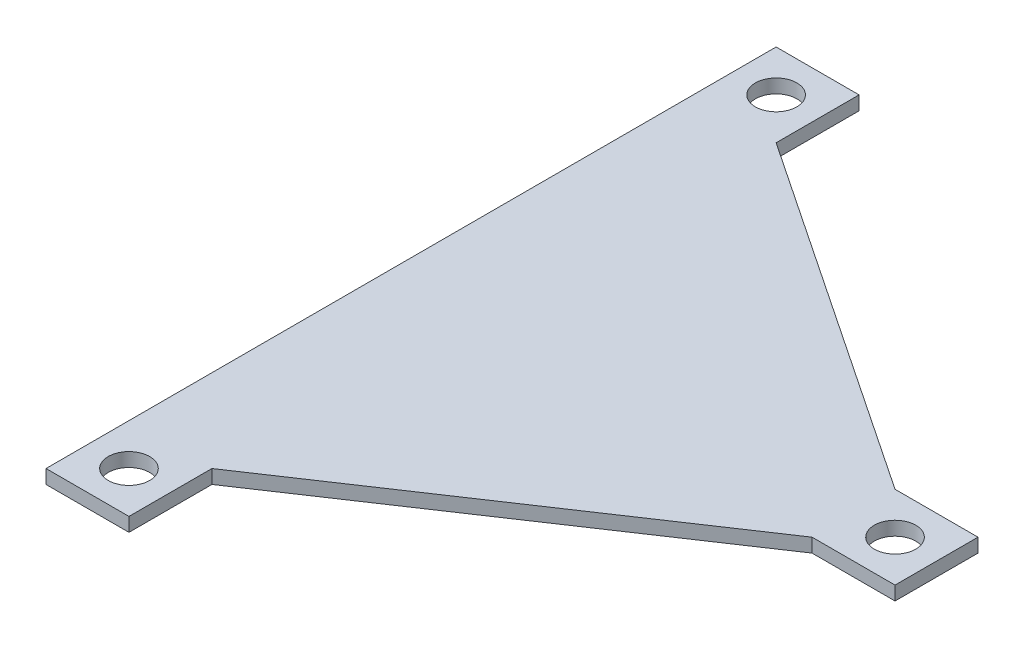
ISO-10303-21;
HEADER;
FILE_DESCRIPTION(('STEP AP214'),'2;1');
FILE_NAME('part.step','',(''),(''),'','','');
FILE_SCHEMA(('AUTOMOTIVE_DESIGN { 1 0 10303 214 1 1 1 1 }'));
ENDSEC;
DATA;
#1=APPLICATION_CONTEXT('core data for automotive mechanical design processes');
#2=APPLICATION_PROTOCOL_DEFINITION('international standard','automotive_design',2000,#1);
#3=PRODUCT_CONTEXT('',#1,'mechanical');
#4=PRODUCT('Part','Part','',(#3));
#5=PRODUCT_RELATED_PRODUCT_CATEGORY('part','',(#4));
#6=PRODUCT_DEFINITION_FORMATION('','',#4);
#7=PRODUCT_DEFINITION_CONTEXT('part definition',#1,'design');
#8=PRODUCT_DEFINITION('design','',#6,#7);
#9=PRODUCT_DEFINITION_SHAPE('','',#8);
#10=(LENGTH_UNIT() NAMED_UNIT(*) SI_UNIT(.MILLI.,.METRE.));
#11=(NAMED_UNIT(*) PLANE_ANGLE_UNIT() SI_UNIT($,.RADIAN.));
#12=(NAMED_UNIT(*) SI_UNIT($,.STERADIAN.) SOLID_ANGLE_UNIT());
#13=UNCERTAINTY_MEASURE_WITH_UNIT(LENGTH_MEASURE(1.E-05),#10,'distance_accuracy_value','');
#14=(GEOMETRIC_REPRESENTATION_CONTEXT(3) GLOBAL_UNCERTAINTY_ASSIGNED_CONTEXT((#13)) GLOBAL_UNIT_ASSIGNED_CONTEXT((#10,
#11,#12)) REPRESENTATION_CONTEXT('',''));
#15=CARTESIAN_POINT('',(0.,0.,0.));
#16=DIRECTION('',(0.,0.,1.));
#17=DIRECTION('',(1.,0.,0.));
#18=AXIS2_PLACEMENT_3D('',#15,#16,#17);
#19=CARTESIAN_POINT('',(0.,1.,0.));
#20=DIRECTION('',(0.,-1.,0.));
#21=DIRECTION('',(0.,0.,-1.));
#22=AXIS2_PLACEMENT_3D('',#19,#20,#21);
#23=PLANE('',#22);
#24=DIRECTION('',(0.,0.,-1.));
#25=VECTOR('',#24,1.);
#26=CARTESIAN_POINT('',(3.,1.,49.8));
#27=LINE('',#26,#25);
#28=CARTESIAN_POINT('',(3.,1.,49.8));
#29=VERTEX_POINT('',#28);
#30=CARTESIAN_POINT('',(3.,1.,43.8));
#31=VERTEX_POINT('',#30);
#32=EDGE_CURVE('E170',#29,#31,#27,.T.);
#33=ORIENTED_EDGE('',*,*,#32,.T.);
#34=DIRECTION('',(0.831065477040289,0.,-0.556174588480809));
#35=VECTOR('',#34,1.);
#36=CARTESIAN_POINT('',(3.,1.,43.8));
#37=LINE('',#36,#35);
#38=CARTESIAN_POINT('',(29.,1.,26.4));
#39=VERTEX_POINT('',#38);
#40=EDGE_CURVE('E104',#31,#39,#37,.T.);
#41=ORIENTED_EDGE('',*,*,#40,.T.);
#42=DIRECTION('',(1.,0.,0.));
#43=VECTOR('',#42,1.);
#44=CARTESIAN_POINT('',(29.,1.,26.4));
#45=LINE('',#44,#43);
#46=CARTESIAN_POINT('',(35.,1.,26.4));
#47=VERTEX_POINT('',#46);
#48=EDGE_CURVE('E187',#39,#47,#45,.T.);
#49=ORIENTED_EDGE('',*,*,#48,.T.);
#50=DIRECTION('',(0.,0.,-1.));
#51=VECTOR('',#50,1.);
#52=CARTESIAN_POINT('',(35.,1.,26.4));
#53=LINE('',#52,#51);
#54=CARTESIAN_POINT('',(35.,1.,20.4));
#55=VERTEX_POINT('',#54);
#56=EDGE_CURVE('E210',#47,#55,#53,.T.);
#57=ORIENTED_EDGE('',*,*,#56,.T.);
#58=DIRECTION('',(-1.,0.,0.));
#59=VECTOR('',#58,1.);
#60=CARTESIAN_POINT('',(35.,1.,20.4));
#61=LINE('',#60,#59);
#62=CARTESIAN_POINT('',(29.,1.,20.4));
#63=VERTEX_POINT('',#62);
#64=EDGE_CURVE('E204',#55,#63,#61,.T.);
#65=ORIENTED_EDGE('',*,*,#64,.T.);
#66=DIRECTION('',(-0.831065477040289,0.,-0.556174588480808));
#67=VECTOR('',#66,1.);
#68=CARTESIAN_POINT('',(29.,1.,20.4));
#69=LINE('',#68,#67);
#70=CARTESIAN_POINT('',(2.99999999999999,1.,3.));
#71=VERTEX_POINT('',#70);
#72=EDGE_CURVE('E206',#63,#71,#69,.T.);
#73=ORIENTED_EDGE('',*,*,#72,.T.);
#74=DIRECTION('',(0.,0.,-1.));
#75=VECTOR('',#74,1.);
#76=CARTESIAN_POINT('',(2.99999999999999,1.,3.));
#77=LINE('',#76,#75);
#78=CARTESIAN_POINT('',(2.99999999999999,1.,-3.));
#79=VERTEX_POINT('',#78);
#80=EDGE_CURVE('E128',#71,#79,#77,.T.);
#81=ORIENTED_EDGE('',*,*,#80,.T.);
#82=DIRECTION('',(-1.,0.,0.));
#83=VECTOR('',#82,1.);
#84=CARTESIAN_POINT('',(2.99999999999999,1.,-3.));
#85=LINE('',#84,#83);
#86=CARTESIAN_POINT('',(-3.00000000000001,1.,-3.));
#87=VERTEX_POINT('',#86);
#88=EDGE_CURVE('E123',#79,#87,#85,.T.);
#89=ORIENTED_EDGE('',*,*,#88,.T.);
#90=DIRECTION('',(0.,0.,1.));
#91=VECTOR('',#90,1.);
#92=CARTESIAN_POINT('',(-3.00000000000001,1.,-3.));
#93=LINE('',#92,#91);
#94=CARTESIAN_POINT('',(-3.,1.,49.8));
#95=VERTEX_POINT('',#94);
#96=EDGE_CURVE('E126',#87,#95,#93,.T.);
#97=ORIENTED_EDGE('',*,*,#96,.T.);
#98=DIRECTION('',(1.,0.,0.));
#99=VECTOR('',#98,1.);
#100=CARTESIAN_POINT('',(-3.,1.,49.8));
#101=LINE('',#100,#99);
#102=EDGE_CURVE('E57',#95,#29,#101,.T.);
#103=ORIENTED_EDGE('',*,*,#102,.T.);
#104=EDGE_LOOP('',(#33,#41,#49,#57,#65,#73,#81,#89,#97,#103));
#105=FACE_BOUND('',#104,.T.);
#106=CARTESIAN_POINT('',(0.,1.,0.));
#107=DIRECTION('',(0.,1.,0.));
#108=DIRECTION('',(0.,0.,1.));
#109=AXIS2_PLACEMENT_3D('',#106,#107,#108);
#110=CIRCLE('',#109,1.5);
#111=CARTESIAN_POINT('',(0.,1.,1.5));
#112=VERTEX_POINT('',#111);
#113=EDGE_CURVE('E155',#112,#112,#110,.T.);
#114=ORIENTED_EDGE('',*,*,#113,.F.);
#115=EDGE_LOOP('',(#114));
#116=FACE_BOUND('',#115,.T.);
#117=CARTESIAN_POINT('',(0.,1.,46.8));
#118=DIRECTION('',(0.,1.,0.));
#119=DIRECTION('',(0.,0.,1.));
#120=AXIS2_PLACEMENT_3D('',#117,#118,#119);
#121=CIRCLE('',#120,1.5);
#122=CARTESIAN_POINT('',(0.,1.,48.3));
#123=VERTEX_POINT('',#122);
#124=EDGE_CURVE('E217',#123,#123,#121,.T.);
#125=ORIENTED_EDGE('',*,*,#124,.F.);
#126=EDGE_LOOP('',(#125));
#127=FACE_BOUND('',#126,.T.);
#128=CARTESIAN_POINT('',(32.,1.,23.4));
#129=DIRECTION('',(0.,1.,0.));
#130=DIRECTION('',(0.,0.,1.));
#131=AXIS2_PLACEMENT_3D('',#128,#129,#130);
#132=CIRCLE('',#131,1.5);
#133=CARTESIAN_POINT('',(32.,1.,24.9));
#134=VERTEX_POINT('',#133);
#135=EDGE_CURVE('E221',#134,#134,#132,.T.);
#136=ORIENTED_EDGE('',*,*,#135,.F.);
#137=EDGE_LOOP('',(#136));
#138=FACE_BOUND('',#137,.T.);
#139=ADVANCED_FACE('F39',(#105,#116,#127,#138),#23,.F.);
#140=CARTESIAN_POINT('',(0.,0.,0.));
#141=DIRECTION('',(0.,-1.,0.));
#142=DIRECTION('',(0.,0.,-1.));
#143=AXIS2_PLACEMENT_3D('',#140,#141,#142);
#144=PLANE('',#143);
#145=CARTESIAN_POINT('',(0.,0.,46.8));
#146=DIRECTION('',(0.,1.,0.));
#147=DIRECTION('',(0.,0.,1.));
#148=AXIS2_PLACEMENT_3D('',#145,#146,#147);
#149=CIRCLE('',#148,1.5);
#150=CARTESIAN_POINT('',(0.,0.,48.3));
#151=VERTEX_POINT('',#150);
#152=EDGE_CURVE('E222',#151,#151,#149,.T.);
#153=ORIENTED_EDGE('',*,*,#152,.T.);
#154=EDGE_LOOP('',(#153));
#155=FACE_BOUND('',#154,.T.);
#156=DIRECTION('',(0.,0.,-1.));
#157=VECTOR('',#156,1.);
#158=CARTESIAN_POINT('',(3.,0.,49.8));
#159=LINE('',#158,#157);
#160=CARTESIAN_POINT('',(3.,0.,49.8));
#161=VERTEX_POINT('',#160);
#162=CARTESIAN_POINT('',(3.,0.,43.8));
#163=VERTEX_POINT('',#162);
#164=EDGE_CURVE('E146',#161,#163,#159,.T.);
#165=ORIENTED_EDGE('',*,*,#164,.F.);
#166=DIRECTION('',(1.,0.,0.));
#167=VECTOR('',#166,1.);
#168=CARTESIAN_POINT('',(-3.,0.,49.8));
#169=LINE('',#168,#167);
#170=CARTESIAN_POINT('',(-3.,0.,49.8));
#171=VERTEX_POINT('',#170);
#172=EDGE_CURVE('E100',#171,#161,#169,.T.);
#173=ORIENTED_EDGE('',*,*,#172,.F.);
#174=DIRECTION('',(0.,0.,1.));
#175=VECTOR('',#174,1.);
#176=CARTESIAN_POINT('',(-3.00000000000001,0.,-3.));
#177=LINE('',#176,#175);
#178=CARTESIAN_POINT('',(-3.00000000000001,0.,-3.));
#179=VERTEX_POINT('',#178);
#180=EDGE_CURVE('E93',#179,#171,#177,.T.);
#181=ORIENTED_EDGE('',*,*,#180,.F.);
#182=DIRECTION('',(-1.,0.,0.));
#183=VECTOR('',#182,1.);
#184=CARTESIAN_POINT('',(2.99999999999999,0.,-3.));
#185=LINE('',#184,#183);
#186=CARTESIAN_POINT('',(2.99999999999999,0.,-3.));
#187=VERTEX_POINT('',#186);
#188=EDGE_CURVE('E139',#187,#179,#185,.T.);
#189=ORIENTED_EDGE('',*,*,#188,.F.);
#190=DIRECTION('',(0.,0.,-1.));
#191=VECTOR('',#190,1.);
#192=CARTESIAN_POINT('',(2.99999999999999,0.,3.));
#193=LINE('',#192,#191);
#194=CARTESIAN_POINT('',(2.99999999999999,0.,3.));
#195=VERTEX_POINT('',#194);
#196=EDGE_CURVE('E165',#195,#187,#193,.T.);
#197=ORIENTED_EDGE('',*,*,#196,.F.);
#198=DIRECTION('',(-0.831065477040289,0.,-0.556174588480808));
#199=VECTOR('',#198,1.);
#200=CARTESIAN_POINT('',(29.,0.,20.4));
#201=LINE('',#200,#199);
#202=CARTESIAN_POINT('',(29.,0.,20.4));
#203=VERTEX_POINT('',#202);
#204=EDGE_CURVE('E159',#203,#195,#201,.T.);
#205=ORIENTED_EDGE('',*,*,#204,.F.);
#206=DIRECTION('',(-1.,0.,0.));
#207=VECTOR('',#206,1.);
#208=CARTESIAN_POINT('',(35.,0.,20.4));
#209=LINE('',#208,#207);
#210=CARTESIAN_POINT('',(35.,0.,20.4));
#211=VERTEX_POINT('',#210);
#212=EDGE_CURVE('E158',#211,#203,#209,.T.);
#213=ORIENTED_EDGE('',*,*,#212,.F.);
#214=DIRECTION('',(0.,0.,-1.));
#215=VECTOR('',#214,1.);
#216=CARTESIAN_POINT('',(35.,0.,26.4));
#217=LINE('',#216,#215);
#218=CARTESIAN_POINT('',(35.,0.,26.4));
#219=VERTEX_POINT('',#218);
#220=EDGE_CURVE('E156',#219,#211,#217,.T.);
#221=ORIENTED_EDGE('',*,*,#220,.F.);
#222=DIRECTION('',(1.,0.,0.));
#223=VECTOR('',#222,1.);
#224=CARTESIAN_POINT('',(29.,0.,26.4));
#225=LINE('',#224,#223);
#226=CARTESIAN_POINT('',(29.,0.,26.4));
#227=VERTEX_POINT('',#226);
#228=EDGE_CURVE('E152',#227,#219,#225,.T.);
#229=ORIENTED_EDGE('',*,*,#228,.F.);
#230=DIRECTION('',(0.831065477040289,0.,-0.556174588480809));
#231=VECTOR('',#230,1.);
#232=CARTESIAN_POINT('',(3.,0.,43.8));
#233=LINE('',#232,#231);
#234=EDGE_CURVE('E151',#163,#227,#233,.T.);
#235=ORIENTED_EDGE('',*,*,#234,.F.);
#236=EDGE_LOOP('',(#165,#173,#181,#189,#197,#205,#213,#221,#229,#235));
#237=FACE_BOUND('',#236,.T.);
#238=CARTESIAN_POINT('',(0.,0.,0.));
#239=DIRECTION('',(0.,1.,0.));
#240=DIRECTION('',(0.,0.,1.));
#241=AXIS2_PLACEMENT_3D('',#238,#239,#240);
#242=CIRCLE('',#241,1.5);
#243=CARTESIAN_POINT('',(0.,0.,1.5));
#244=VERTEX_POINT('',#243);
#245=EDGE_CURVE('E214',#244,#244,#242,.T.);
#246=ORIENTED_EDGE('',*,*,#245,.T.);
#247=EDGE_LOOP('',(#246));
#248=FACE_BOUND('',#247,.T.);
#249=CARTESIAN_POINT('',(32.,0.,23.4));
#250=DIRECTION('',(0.,1.,0.));
#251=DIRECTION('',(0.,0.,1.));
#252=AXIS2_PLACEMENT_3D('',#249,#250,#251);
#253=CIRCLE('',#252,1.5);
#254=CARTESIAN_POINT('',(32.,0.,24.9));
#255=VERTEX_POINT('',#254);
#256=EDGE_CURVE('E230',#255,#255,#253,.T.);
#257=ORIENTED_EDGE('',*,*,#256,.T.);
#258=EDGE_LOOP('',(#257));
#259=FACE_BOUND('',#258,.T.);
#260=ADVANCED_FACE('F192',(#155,#237,#248,#259),#144,.T.);
#261=CARTESIAN_POINT('',(3.,1.,49.8));
#262=DIRECTION('',(-1.,0.,0.));
#263=DIRECTION('',(0.,0.,1.));
#264=AXIS2_PLACEMENT_3D('',#261,#262,#263);
#265=PLANE('',#264);
#266=ORIENTED_EDGE('',*,*,#164,.T.);
#267=DIRECTION('',(0.,-1.,0.));
#268=VECTOR('',#267,1.);
#269=CARTESIAN_POINT('',(3.,1.,43.8));
#270=LINE('',#269,#268);
#271=EDGE_CURVE('E11',#31,#163,#270,.T.);
#272=ORIENTED_EDGE('',*,*,#271,.F.);
#273=ORIENTED_EDGE('',*,*,#32,.F.);
#274=DIRECTION('',(0.,-1.,0.));
#275=VECTOR('',#274,1.);
#276=CARTESIAN_POINT('',(3.,1.,49.8));
#277=LINE('',#276,#275);
#278=EDGE_CURVE('E145',#29,#161,#277,.T.);
#279=ORIENTED_EDGE('',*,*,#278,.T.);
#280=EDGE_LOOP('',(#266,#272,#273,#279));
#281=FACE_BOUND('',#280,.T.);
#282=ADVANCED_FACE('F41',(#281),#265,.F.);
#283=CARTESIAN_POINT('',(3.,1.,43.8));
#284=DIRECTION('',(-0.556174588480809,0.,-0.831065477040289));
#285=DIRECTION('',(-0.831065477040289,0.,0.556174588480809));
#286=AXIS2_PLACEMENT_3D('',#283,#284,#285);
#287=PLANE('',#286);
#288=ORIENTED_EDGE('',*,*,#234,.T.);
#289=DIRECTION('',(0.,-1.,0.));
#290=VECTOR('',#289,1.);
#291=CARTESIAN_POINT('',(29.,1.,26.4));
#292=LINE('',#291,#290);
#293=EDGE_CURVE('E48',#39,#227,#292,.T.);
#294=ORIENTED_EDGE('',*,*,#293,.F.);
#295=ORIENTED_EDGE('',*,*,#40,.F.);
#296=ORIENTED_EDGE('',*,*,#271,.T.);
#297=EDGE_LOOP('',(#288,#294,#295,#296));
#298=FACE_BOUND('',#297,.T.);
#299=ADVANCED_FACE('F270',(#298),#287,.F.);
#300=CARTESIAN_POINT('',(29.,1.,26.4));
#301=DIRECTION('',(0.,0.,-1.));
#302=DIRECTION('',(-1.,0.,0.));
#303=AXIS2_PLACEMENT_3D('',#300,#301,#302);
#304=PLANE('',#303);
#305=ORIENTED_EDGE('',*,*,#228,.T.);
#306=DIRECTION('',(0.,-1.,0.));
#307=VECTOR('',#306,1.);
#308=CARTESIAN_POINT('',(35.,1.,26.4));
#309=LINE('',#308,#307);
#310=EDGE_CURVE('E180',#47,#219,#309,.T.);
#311=ORIENTED_EDGE('',*,*,#310,.F.);
#312=ORIENTED_EDGE('',*,*,#48,.F.);
#313=ORIENTED_EDGE('',*,*,#293,.T.);
#314=EDGE_LOOP('',(#305,#311,#312,#313));
#315=FACE_BOUND('',#314,.T.);
#316=ADVANCED_FACE('F186',(#315),#304,.F.);
#317=CARTESIAN_POINT('',(35.,1.,26.4));
#318=DIRECTION('',(-1.,0.,0.));
#319=DIRECTION('',(0.,0.,1.));
#320=AXIS2_PLACEMENT_3D('',#317,#318,#319);
#321=PLANE('',#320);
#322=ORIENTED_EDGE('',*,*,#220,.T.);
#323=DIRECTION('',(0.,-1.,0.));
#324=VECTOR('',#323,1.);
#325=CARTESIAN_POINT('',(35.,1.,20.4));
#326=LINE('',#325,#324);
#327=EDGE_CURVE('E177',#55,#211,#326,.T.);
#328=ORIENTED_EDGE('',*,*,#327,.F.);
#329=ORIENTED_EDGE('',*,*,#56,.F.);
#330=ORIENTED_EDGE('',*,*,#310,.T.);
#331=EDGE_LOOP('',(#322,#328,#329,#330));
#332=FACE_BOUND('',#331,.T.);
#333=ADVANCED_FACE('F196',(#332),#321,.F.);
#334=CARTESIAN_POINT('',(35.,1.,20.4));
#335=DIRECTION('',(0.,0.,1.));
#336=DIRECTION('',(1.,0.,0.));
#337=AXIS2_PLACEMENT_3D('',#334,#335,#336);
#338=PLANE('',#337);
#339=ORIENTED_EDGE('',*,*,#212,.T.);
#340=DIRECTION('',(0.,-1.,0.));
#341=VECTOR('',#340,1.);
#342=CARTESIAN_POINT('',(29.,1.,20.4));
#343=LINE('',#342,#341);
#344=EDGE_CURVE('E173',#63,#203,#343,.T.);
#345=ORIENTED_EDGE('',*,*,#344,.F.);
#346=ORIENTED_EDGE('',*,*,#64,.F.);
#347=ORIENTED_EDGE('',*,*,#327,.T.);
#348=EDGE_LOOP('',(#339,#345,#346,#347));
#349=FACE_BOUND('',#348,.T.);
#350=ADVANCED_FACE('F205',(#349),#338,.F.);
#351=CARTESIAN_POINT('',(29.,1.,20.4));
#352=DIRECTION('',(-0.556174588480808,0.,0.831065477040289));
#353=DIRECTION('',(0.831065477040289,0.,0.556174588480808));
#354=AXIS2_PLACEMENT_3D('',#351,#352,#353);
#355=PLANE('',#354);
#356=ORIENTED_EDGE('',*,*,#204,.T.);
#357=DIRECTION('',(0.,-1.,0.));
#358=VECTOR('',#357,1.);
#359=CARTESIAN_POINT('',(2.99999999999999,1.,3.));
#360=LINE('',#359,#358);
#361=EDGE_CURVE('E171',#71,#195,#360,.T.);
#362=ORIENTED_EDGE('',*,*,#361,.F.);
#363=ORIENTED_EDGE('',*,*,#72,.F.);
#364=ORIENTED_EDGE('',*,*,#344,.T.);
#365=EDGE_LOOP('',(#356,#362,#363,#364));
#366=FACE_BOUND('',#365,.T.);
#367=ADVANCED_FACE('F260',(#366),#355,.F.);
#368=CARTESIAN_POINT('',(2.99999999999999,1.,3.));
#369=DIRECTION('',(-1.,0.,0.));
#370=DIRECTION('',(0.,0.,1.));
#371=AXIS2_PLACEMENT_3D('',#368,#369,#370);
#372=PLANE('',#371);
#373=ORIENTED_EDGE('',*,*,#196,.T.);
#374=DIRECTION('',(0.,-1.,0.));
#375=VECTOR('',#374,1.);
#376=CARTESIAN_POINT('',(2.99999999999999,1.,-3.));
#377=LINE('',#376,#375);
#378=EDGE_CURVE('E138',#79,#187,#377,.T.);
#379=ORIENTED_EDGE('',*,*,#378,.F.);
#380=ORIENTED_EDGE('',*,*,#80,.F.);
#381=ORIENTED_EDGE('',*,*,#361,.T.);
#382=EDGE_LOOP('',(#373,#379,#380,#381));
#383=FACE_BOUND('',#382,.T.);
#384=ADVANCED_FACE('F255',(#383),#372,.F.);
#385=CARTESIAN_POINT('',(2.99999999999999,1.,-3.));
#386=DIRECTION('',(0.,0.,1.));
#387=DIRECTION('',(1.,0.,0.));
#388=AXIS2_PLACEMENT_3D('',#385,#386,#387);
#389=PLANE('',#388);
#390=ORIENTED_EDGE('',*,*,#188,.T.);
#391=DIRECTION('',(0.,-1.,0.));
#392=VECTOR('',#391,1.);
#393=CARTESIAN_POINT('',(-3.00000000000001,1.,-3.));
#394=LINE('',#393,#392);
#395=EDGE_CURVE('E134',#87,#179,#394,.T.);
#396=ORIENTED_EDGE('',*,*,#395,.F.);
#397=ORIENTED_EDGE('',*,*,#88,.F.);
#398=ORIENTED_EDGE('',*,*,#378,.T.);
#399=EDGE_LOOP('',(#390,#396,#397,#398));
#400=FACE_BOUND('',#399,.T.);
#401=ADVANCED_FACE('F136',(#400),#389,.F.);
#402=CARTESIAN_POINT('',(-3.00000000000001,1.,-3.));
#403=DIRECTION('',(1.,0.,0.));
#404=DIRECTION('',(0.,0.,-1.));
#405=AXIS2_PLACEMENT_3D('',#402,#403,#404);
#406=PLANE('',#405);
#407=ORIENTED_EDGE('',*,*,#180,.T.);
#408=DIRECTION('',(0.,-1.,0.));
#409=VECTOR('',#408,1.);
#410=CARTESIAN_POINT('',(-3.,1.,49.8));
#411=LINE('',#410,#409);
#412=EDGE_CURVE('E140',#95,#171,#411,.T.);
#413=ORIENTED_EDGE('',*,*,#412,.F.);
#414=ORIENTED_EDGE('',*,*,#96,.F.);
#415=ORIENTED_EDGE('',*,*,#395,.T.);
#416=EDGE_LOOP('',(#407,#413,#414,#415));
#417=FACE_BOUND('',#416,.T.);
#418=ADVANCED_FACE('F142',(#417),#406,.F.);
#419=CARTESIAN_POINT('',(-3.,1.,49.8));
#420=DIRECTION('',(0.,0.,-1.));
#421=DIRECTION('',(-1.,0.,0.));
#422=AXIS2_PLACEMENT_3D('',#419,#420,#421);
#423=PLANE('',#422);
#424=ORIENTED_EDGE('',*,*,#172,.T.);
#425=ORIENTED_EDGE('',*,*,#278,.F.);
#426=ORIENTED_EDGE('',*,*,#102,.F.);
#427=ORIENTED_EDGE('',*,*,#412,.T.);
#428=EDGE_LOOP('',(#424,#425,#426,#427));
#429=FACE_BOUND('',#428,.T.);
#430=ADVANCED_FACE('F247',(#429),#423,.F.);
#431=CARTESIAN_POINT('',(0.,1.,0.));
#432=DIRECTION('',(0.,-1.,0.));
#433=DIRECTION('',(0.,0.,-1.));
#434=AXIS2_PLACEMENT_3D('',#431,#432,#433);
#435=CYLINDRICAL_SURFACE('',#434,1.5);
#436=ORIENTED_EDGE('',*,*,#113,.T.);
#437=EDGE_LOOP('',(#436));
#438=FACE_BOUND('',#437,.T.);
#439=ORIENTED_EDGE('',*,*,#245,.F.);
#440=EDGE_LOOP('',(#439));
#441=FACE_BOUND('',#440,.T.);
#442=ADVANCED_FACE('F243',(#438,#441),#435,.F.);
#443=CARTESIAN_POINT('',(0.,1.,46.8));
#444=DIRECTION('',(0.,-1.,0.));
#445=DIRECTION('',(0.,0.,-1.));
#446=AXIS2_PLACEMENT_3D('',#443,#444,#445);
#447=CYLINDRICAL_SURFACE('',#446,1.5);
#448=ORIENTED_EDGE('',*,*,#124,.T.);
#449=EDGE_LOOP('',(#448));
#450=FACE_BOUND('',#449,.T.);
#451=ORIENTED_EDGE('',*,*,#152,.F.);
#452=EDGE_LOOP('',(#451));
#453=FACE_BOUND('',#452,.T.);
#454=ADVANCED_FACE('F342',(#450,#453),#447,.F.);
#455=CARTESIAN_POINT('',(32.,1.,23.4));
#456=DIRECTION('',(0.,-1.,0.));
#457=DIRECTION('',(0.,0.,-1.));
#458=AXIS2_PLACEMENT_3D('',#455,#456,#457);
#459=CYLINDRICAL_SURFACE('',#458,1.5);
#460=ORIENTED_EDGE('',*,*,#135,.T.);
#461=EDGE_LOOP('',(#460));
#462=FACE_BOUND('',#461,.T.);
#463=ORIENTED_EDGE('',*,*,#256,.F.);
#464=EDGE_LOOP('',(#463));
#465=FACE_BOUND('',#464,.T.);
#466=ADVANCED_FACE('F234',(#462,#465),#459,.F.);
#467=CLOSED_SHELL('',(#139,#260,#282,#299,#316,#333,#350,#367,#384,#401,#418,#430,#442,#454,#466));
#468=MANIFOLD_SOLID_BREP('B2',#467);
#469=ADVANCED_BREP_SHAPE_REPRESENTATION('',(#18,#468),#14);
#470=SHAPE_DEFINITION_REPRESENTATION(#9,#469);
ENDSEC;
END-ISO-10303-21;
